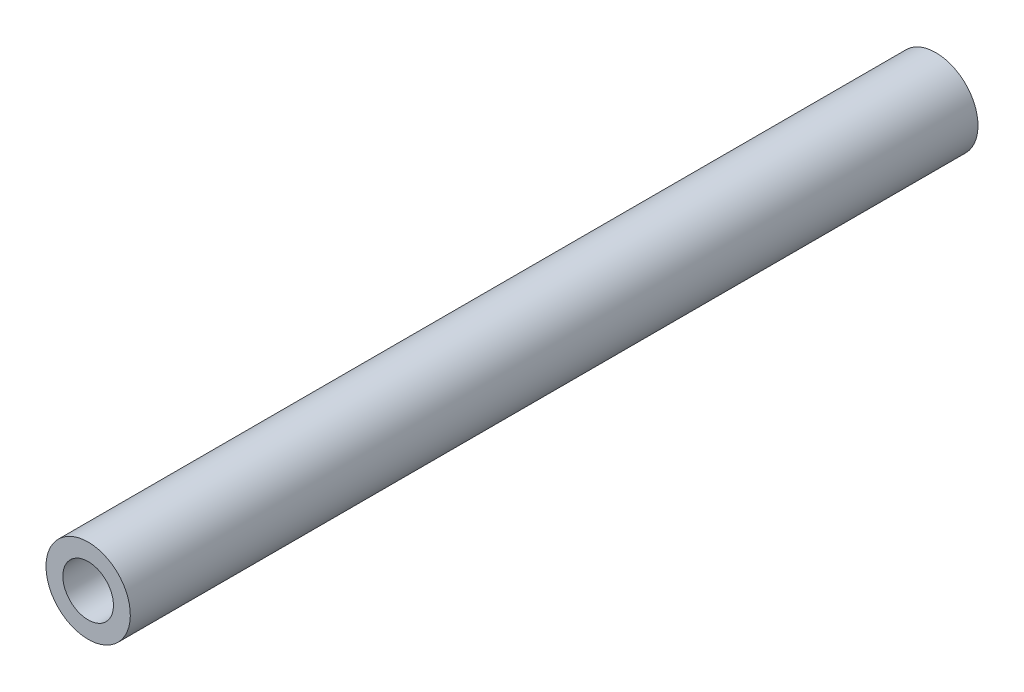
ISO-10303-21;
HEADER;
FILE_DESCRIPTION(('STEP AP214'),'2;1');
FILE_NAME('part.step','',(''),(''),'','','');
FILE_SCHEMA(('AUTOMOTIVE_DESIGN { 1 0 10303 214 1 1 1 1 }'));
ENDSEC;
DATA;
#1=APPLICATION_CONTEXT('core data for automotive mechanical design processes');
#2=APPLICATION_PROTOCOL_DEFINITION('international standard','automotive_design',2000,#1);
#3=PRODUCT_CONTEXT('',#1,'mechanical');
#4=PRODUCT('Part','Part','',(#3));
#5=PRODUCT_RELATED_PRODUCT_CATEGORY('part','',(#4));
#6=PRODUCT_DEFINITION_FORMATION('','',#4);
#7=PRODUCT_DEFINITION_CONTEXT('part definition',#1,'design');
#8=PRODUCT_DEFINITION('design','',#6,#7);
#9=PRODUCT_DEFINITION_SHAPE('','',#8);
#10=(LENGTH_UNIT() NAMED_UNIT(*) SI_UNIT(.MILLI.,.METRE.));
#11=(NAMED_UNIT(*) PLANE_ANGLE_UNIT() SI_UNIT($,.RADIAN.));
#12=(NAMED_UNIT(*) SI_UNIT($,.STERADIAN.) SOLID_ANGLE_UNIT());
#13=UNCERTAINTY_MEASURE_WITH_UNIT(LENGTH_MEASURE(1.E-05),#10,'distance_accuracy_value','');
#14=(GEOMETRIC_REPRESENTATION_CONTEXT(3) GLOBAL_UNCERTAINTY_ASSIGNED_CONTEXT((#13)) GLOBAL_UNIT_ASSIGNED_CONTEXT((#10,
#11,#12)) REPRESENTATION_CONTEXT('',''));
#15=CARTESIAN_POINT('',(0.,0.,0.));
#16=DIRECTION('',(0.,0.,1.));
#17=DIRECTION('',(1.,0.,0.));
#18=AXIS2_PLACEMENT_3D('',#15,#16,#17);
#19=CARTESIAN_POINT('',(0.,0.,-30.0521739130434));
#20=DIRECTION('',(0.,0.,-1.));
#21=DIRECTION('',(0.,1.,0.));
#22=AXIS2_PLACEMENT_3D('',#19,#20,#21);
#23=CYLINDRICAL_SURFACE('',#22,29.9999999999999);
#24=CARTESIAN_POINT('',(0.,0.,0.));
#25=DIRECTION('',(0.,0.,-1.));
#26=DIRECTION('',(0.,1.,0.));
#27=AXIS2_PLACEMENT_3D('',#24,#25,#26);
#28=CIRCLE('',#27,29.9999999999999);
#29=CARTESIAN_POINT('',(0.,29.9999999999999,0.));
#30=VERTEX_POINT('',#29);
#31=EDGE_CURVE('E10',#30,#30,#28,.T.);
#32=ORIENTED_EDGE('',*,*,#31,.T.);
#33=EDGE_LOOP('',(#32));
#34=FACE_BOUND('',#33,.T.);
#35=CARTESIAN_POINT('',(0.,-1.2029543230586E-13,1005.));
#36=DIRECTION('',(0.,0.,-1.));
#37=DIRECTION('',(0.,1.,0.));
#38=AXIS2_PLACEMENT_3D('',#35,#36,#37);
#39=CIRCLE('',#38,30.);
#40=CARTESIAN_POINT('',(0.,29.9999999999999,1005.));
#41=VERTEX_POINT('',#40);
#42=EDGE_CURVE('E57',#41,#41,#39,.T.);
#43=ORIENTED_EDGE('',*,*,#42,.F.);
#44=EDGE_LOOP('',(#43));
#45=FACE_BOUND('',#44,.T.);
#46=ADVANCED_FACE('F39',(#34,#45),#23,.F.);
#47=CARTESIAN_POINT('',(0.,29.9999999999999,0.));
#48=DIRECTION('',(0.,0.,-1.));
#49=DIRECTION('',(0.,1.,0.));
#50=AXIS2_PLACEMENT_3D('',#47,#48,#49);
#51=PLANE('',#50);
#52=CARTESIAN_POINT('',(0.,0.,0.));
#53=DIRECTION('',(0.,0.,-1.));
#54=DIRECTION('',(0.,1.,0.));
#55=AXIS2_PLACEMENT_3D('',#52,#53,#54);
#56=CIRCLE('',#55,50.);
#57=CARTESIAN_POINT('',(0.,50.,0.));
#58=VERTEX_POINT('',#57);
#59=EDGE_CURVE('E46',#58,#58,#56,.T.);
#60=ORIENTED_EDGE('',*,*,#59,.T.);
#61=EDGE_LOOP('',(#60));
#62=FACE_BOUND('',#61,.T.);
#63=ORIENTED_EDGE('',*,*,#31,.F.);
#64=EDGE_LOOP('',(#63));
#65=FACE_BOUND('',#64,.T.);
#66=ADVANCED_FACE('F67',(#62,#65),#51,.T.);
#67=CARTESIAN_POINT('',(0.,0.,-30.0521739130434));
#68=DIRECTION('',(0.,0.,-1.));
#69=DIRECTION('',(0.,1.,0.));
#70=AXIS2_PLACEMENT_3D('',#67,#68,#69);
#71=CYLINDRICAL_SURFACE('',#70,50.);
#72=CARTESIAN_POINT('',(0.,-1.2029543230586E-13,1005.));
#73=DIRECTION('',(0.,0.,-1.));
#74=DIRECTION('',(0.,1.,0.));
#75=AXIS2_PLACEMENT_3D('',#72,#73,#74);
#76=CIRCLE('',#75,50.);
#77=CARTESIAN_POINT('',(0.,49.9999999999999,1005.));
#78=VERTEX_POINT('',#77);
#79=EDGE_CURVE('E52',#78,#78,#76,.T.);
#80=ORIENTED_EDGE('',*,*,#79,.T.);
#81=EDGE_LOOP('',(#80));
#82=FACE_BOUND('',#81,.T.);
#83=ORIENTED_EDGE('',*,*,#59,.F.);
#84=EDGE_LOOP('',(#83));
#85=FACE_BOUND('',#84,.T.);
#86=ADVANCED_FACE('F71',(#82,#85),#71,.T.);
#87=CARTESIAN_POINT('',(0.,49.9999999999999,1005.));
#88=DIRECTION('',(0.,0.,1.));
#89=DIRECTION('',(0.,-1.,0.));
#90=AXIS2_PLACEMENT_3D('',#87,#88,#89);
#91=PLANE('',#90);
#92=ORIENTED_EDGE('',*,*,#42,.T.);
#93=EDGE_LOOP('',(#92));
#94=FACE_BOUND('',#93,.T.);
#95=ORIENTED_EDGE('',*,*,#79,.F.);
#96=EDGE_LOOP('',(#95));
#97=FACE_BOUND('',#96,.T.);
#98=ADVANCED_FACE('F63',(#94,#97),#91,.T.);
#99=CLOSED_SHELL('',(#46,#66,#86,#98));
#100=MANIFOLD_SOLID_BREP('B2',#99);
#101=ADVANCED_BREP_SHAPE_REPRESENTATION('',(#18,#100),#14);
#102=SHAPE_DEFINITION_REPRESENTATION(#9,#101);
ENDSEC;
END-ISO-10303-21;
